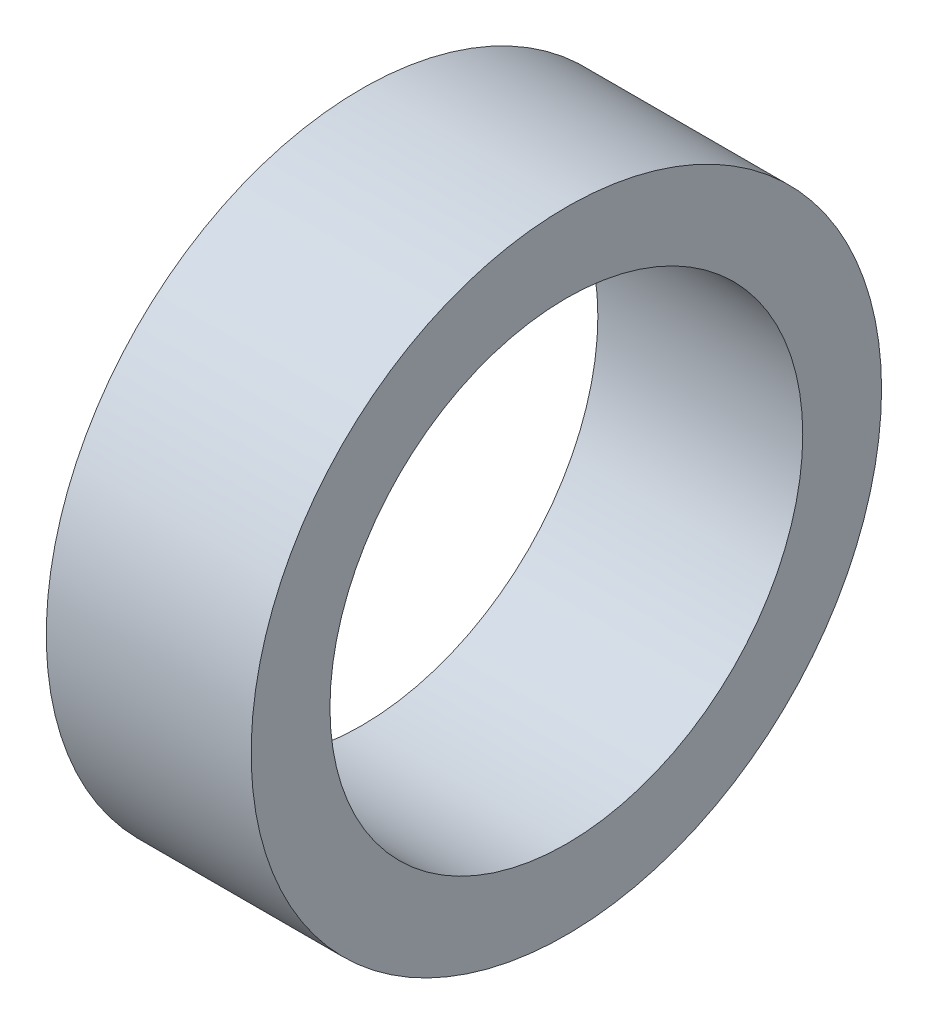
ISO-10303-21;
HEADER;
FILE_DESCRIPTION(('STEP AP214'),'2;1');
FILE_NAME('part.step','',(''),(''),'','','');
FILE_SCHEMA(('AUTOMOTIVE_DESIGN { 1 0 10303 214 1 1 1 1 }'));
ENDSEC;
DATA;
#1=APPLICATION_CONTEXT('core data for automotive mechanical design processes');
#2=APPLICATION_PROTOCOL_DEFINITION('international standard','automotive_design',2000,#1);
#3=PRODUCT_CONTEXT('',#1,'mechanical');
#4=PRODUCT('Part','Part','',(#3));
#5=PRODUCT_RELATED_PRODUCT_CATEGORY('part','',(#4));
#6=PRODUCT_DEFINITION_FORMATION('','',#4);
#7=PRODUCT_DEFINITION_CONTEXT('part definition',#1,'design');
#8=PRODUCT_DEFINITION('design','',#6,#7);
#9=PRODUCT_DEFINITION_SHAPE('','',#8);
#10=(LENGTH_UNIT() NAMED_UNIT(*) SI_UNIT(.MILLI.,.METRE.));
#11=(NAMED_UNIT(*) PLANE_ANGLE_UNIT() SI_UNIT($,.RADIAN.));
#12=(NAMED_UNIT(*) SI_UNIT($,.STERADIAN.) SOLID_ANGLE_UNIT());
#13=UNCERTAINTY_MEASURE_WITH_UNIT(LENGTH_MEASURE(1.E-05),#10,'distance_accuracy_value','');
#14=(GEOMETRIC_REPRESENTATION_CONTEXT(3) GLOBAL_UNCERTAINTY_ASSIGNED_CONTEXT((#13)) GLOBAL_UNIT_ASSIGNED_CONTEXT((#10,
#11,#12)) REPRESENTATION_CONTEXT('',''));
#15=CARTESIAN_POINT('',(0.,0.,0.));
#16=DIRECTION('',(0.,0.,1.));
#17=DIRECTION('',(1.,0.,0.));
#18=AXIS2_PLACEMENT_3D('',#15,#16,#17);
#19=CARTESIAN_POINT('',(0.007000000000005,10.007,10.007));
#20=DIRECTION('',(1.,0.,0.));
#21=DIRECTION('',(0.,0.,-1.));
#22=AXIS2_PLACEMENT_3D('',#19,#20,#21);
#23=CYLINDRICAL_SURFACE('',#22,7.5);
#24=CARTESIAN_POINT('',(0.007000000000005,10.007,10.007));
#25=DIRECTION('',(1.,0.,0.));
#26=DIRECTION('',(0.,0.,-1.));
#27=AXIS2_PLACEMENT_3D('',#24,#25,#26);
#28=CIRCLE('',#27,7.5);
#29=CARTESIAN_POINT('',(0.007000000000005,10.007,2.507));
#30=VERTEX_POINT('',#29);
#31=EDGE_CURVE('E25',#30,#30,#28,.F.);
#32=ORIENTED_EDGE('',*,*,#31,.T.);
#33=EDGE_LOOP('',(#32));
#34=FACE_BOUND('',#33,.T.);
#35=CARTESIAN_POINT('',(6.507,10.007,10.007));
#36=DIRECTION('',(1.,0.,0.));
#37=DIRECTION('',(0.,0.,-1.));
#38=AXIS2_PLACEMENT_3D('',#35,#36,#37);
#39=CIRCLE('',#38,7.5);
#40=CARTESIAN_POINT('',(6.507,10.007,2.507));
#41=VERTEX_POINT('',#40);
#42=EDGE_CURVE('E16',#41,#41,#39,.F.);
#43=ORIENTED_EDGE('',*,*,#42,.F.);
#44=EDGE_LOOP('',(#43));
#45=FACE_BOUND('',#44,.T.);
#46=ADVANCED_FACE('F13',(#34,#45),#23,.F.);
#47=CARTESIAN_POINT('',(6.507,10.007,10.007));
#48=DIRECTION('',(1.,0.,0.));
#49=DIRECTION('',(0.,0.,-1.));
#50=AXIS2_PLACEMENT_3D('',#47,#48,#49);
#51=PLANE('',#50);
#52=ORIENTED_EDGE('',*,*,#42,.T.);
#53=EDGE_LOOP('',(#52));
#54=FACE_BOUND('',#53,.T.);
#55=CARTESIAN_POINT('',(6.507,10.007,10.007));
#56=DIRECTION('',(1.,0.,0.));
#57=DIRECTION('',(0.,0.,-1.));
#58=AXIS2_PLACEMENT_3D('',#55,#56,#57);
#59=CIRCLE('',#58,10.);
#60=CARTESIAN_POINT('',(6.507,10.007,0.00700000000000006));
#61=VERTEX_POINT('',#60);
#62=EDGE_CURVE('E20',#61,#61,#59,.F.);
#63=ORIENTED_EDGE('',*,*,#62,.F.);
#64=EDGE_LOOP('',(#63));
#65=FACE_BOUND('',#64,.T.);
#66=ADVANCED_FACE('F33',(#54,#65),#51,.T.);
#67=CARTESIAN_POINT('',(0.007000000000005,10.007,10.007));
#68=DIRECTION('',(1.,0.,0.));
#69=DIRECTION('',(0.,0.,-1.));
#70=AXIS2_PLACEMENT_3D('',#67,#68,#69);
#71=PLANE('',#70);
#72=ORIENTED_EDGE('',*,*,#31,.F.);
#73=EDGE_LOOP('',(#72));
#74=FACE_BOUND('',#73,.T.);
#75=CARTESIAN_POINT('',(0.007000000000005,10.007,10.007));
#76=DIRECTION('',(1.,0.,0.));
#77=DIRECTION('',(0.,0.,-1.));
#78=AXIS2_PLACEMENT_3D('',#75,#76,#77);
#79=CIRCLE('',#78,10.);
#80=CARTESIAN_POINT('',(0.007000000000005,10.007,0.00700000000000006));
#81=VERTEX_POINT('',#80);
#82=EDGE_CURVE('E8',#81,#81,#79,.T.);
#83=ORIENTED_EDGE('',*,*,#82,.F.);
#84=EDGE_LOOP('',(#83));
#85=FACE_BOUND('',#84,.T.);
#86=ADVANCED_FACE('F41',(#74,#85),#71,.F.);
#87=CARTESIAN_POINT('',(0.007000000000005,10.007,10.007));
#88=DIRECTION('',(1.,0.,0.));
#89=DIRECTION('',(0.,0.,-1.));
#90=AXIS2_PLACEMENT_3D('',#87,#88,#89);
#91=CYLINDRICAL_SURFACE('',#90,10.);
#92=ORIENTED_EDGE('',*,*,#82,.T.);
#93=EDGE_LOOP('',(#92));
#94=FACE_BOUND('',#93,.T.);
#95=ORIENTED_EDGE('',*,*,#62,.T.);
#96=EDGE_LOOP('',(#95));
#97=FACE_BOUND('',#96,.T.);
#98=ADVANCED_FACE('F42',(#94,#97),#91,.T.);
#99=CLOSED_SHELL('',(#46,#66,#86,#98));
#100=MANIFOLD_SOLID_BREP('B1',#99);
#101=ADVANCED_BREP_SHAPE_REPRESENTATION('',(#18,#100),#14);
#102=SHAPE_DEFINITION_REPRESENTATION(#9,#101);
ENDSEC;
END-ISO-10303-21;
